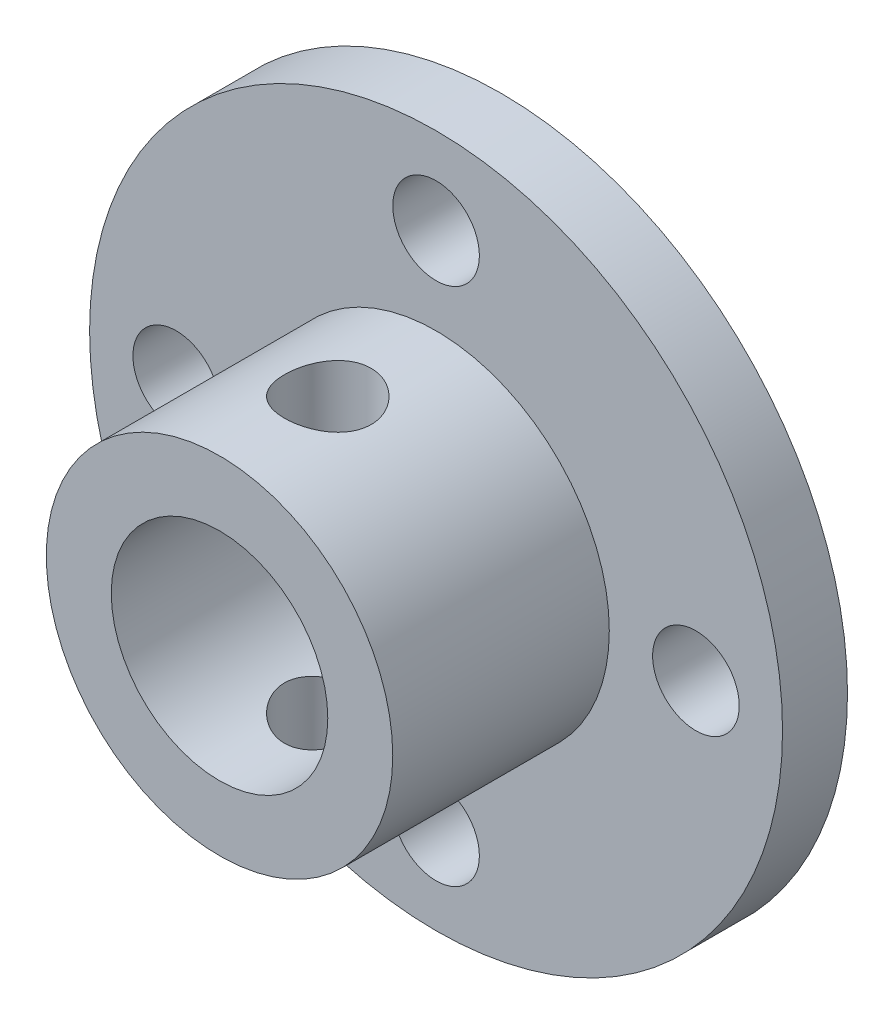
ISO-10303-21;
HEADER;
FILE_DESCRIPTION(('STEP AP214'),'2;1');
FILE_NAME('part.step','',(''),(''),'','','');
FILE_SCHEMA(('AUTOMOTIVE_DESIGN { 1 0 10303 214 1 1 1 1 }'));
ENDSEC;
DATA;
#1=APPLICATION_CONTEXT('core data for automotive mechanical design processes');
#2=APPLICATION_PROTOCOL_DEFINITION('international standard','automotive_design',2000,#1);
#3=PRODUCT_CONTEXT('',#1,'mechanical');
#4=PRODUCT('Part','Part','',(#3));
#5=PRODUCT_RELATED_PRODUCT_CATEGORY('part','',(#4));
#6=PRODUCT_DEFINITION_FORMATION('','',#4);
#7=PRODUCT_DEFINITION_CONTEXT('part definition',#1,'design');
#8=PRODUCT_DEFINITION('design','',#6,#7);
#9=PRODUCT_DEFINITION_SHAPE('','',#8);
#10=(LENGTH_UNIT() NAMED_UNIT(*) SI_UNIT(.MILLI.,.METRE.));
#11=(NAMED_UNIT(*) PLANE_ANGLE_UNIT() SI_UNIT($,.RADIAN.));
#12=(NAMED_UNIT(*) SI_UNIT($,.STERADIAN.) SOLID_ANGLE_UNIT());
#13=UNCERTAINTY_MEASURE_WITH_UNIT(LENGTH_MEASURE(1.E-05),#10,'distance_accuracy_value','');
#14=(GEOMETRIC_REPRESENTATION_CONTEXT(3) GLOBAL_UNCERTAINTY_ASSIGNED_CONTEXT((#13)) GLOBAL_UNIT_ASSIGNED_CONTEXT((#10,
#11,#12)) REPRESENTATION_CONTEXT('',''));
#15=CARTESIAN_POINT('',(0.,0.,0.));
#16=DIRECTION('',(0.,0.,1.));
#17=DIRECTION('',(1.,0.,0.));
#18=AXIS2_PLACEMENT_3D('',#15,#16,#17);
#19=CARTESIAN_POINT('',(0.,0.,3.));
#20=DIRECTION('',(0.,0.,-1.));
#21=DIRECTION('',(-1.,0.,0.));
#22=AXIS2_PLACEMENT_3D('',#19,#20,#21);
#23=CYLINDRICAL_SURFACE('',#22,16.);
#24=CARTESIAN_POINT('',(0.,0.,3.));
#25=DIRECTION('',(0.,0.,1.));
#26=DIRECTION('',(1.,0.,0.));
#27=AXIS2_PLACEMENT_3D('',#24,#25,#26);
#28=CIRCLE('',#27,16.);
#29=CARTESIAN_POINT('',(16.,0.,3.));
#30=VERTEX_POINT('',#29);
#31=EDGE_CURVE('E54',#30,#30,#28,.T.);
#32=ORIENTED_EDGE('',*,*,#31,.F.);
#33=EDGE_LOOP('',(#32));
#34=FACE_BOUND('',#33,.T.);
#35=CARTESIAN_POINT('',(0.,0.,0.));
#36=DIRECTION('',(0.,0.,1.));
#37=DIRECTION('',(1.,0.,0.));
#38=AXIS2_PLACEMENT_3D('',#35,#36,#37);
#39=CIRCLE('',#38,16.);
#40=CARTESIAN_POINT('',(16.,0.,0.));
#41=VERTEX_POINT('',#40);
#42=EDGE_CURVE('E60',#41,#41,#39,.T.);
#43=ORIENTED_EDGE('',*,*,#42,.T.);
#44=EDGE_LOOP('',(#43));
#45=FACE_BOUND('',#44,.T.);
#46=ADVANCED_FACE('F41',(#34,#45),#23,.T.);
#47=CARTESIAN_POINT('',(0.,0.,3.));
#48=DIRECTION('',(0.,0.,1.));
#49=DIRECTION('',(1.,0.,0.));
#50=AXIS2_PLACEMENT_3D('',#47,#48,#49);
#51=PLANE('',#50);
#52=CARTESIAN_POINT('',(0.,12.,3.));
#53=DIRECTION('',(0.,0.,1.));
#54=DIRECTION('',(1.,0.,0.));
#55=AXIS2_PLACEMENT_3D('',#52,#53,#54);
#56=CIRCLE('',#55,2.);
#57=CARTESIAN_POINT('',(2.,12.,3.));
#58=VERTEX_POINT('',#57);
#59=EDGE_CURVE('E280',#58,#58,#56,.T.);
#60=ORIENTED_EDGE('',*,*,#59,.F.);
#61=EDGE_LOOP('',(#60));
#62=FACE_BOUND('',#61,.T.);
#63=CARTESIAN_POINT('',(12.,0.,3.));
#64=DIRECTION('',(0.,0.,1.));
#65=DIRECTION('',(1.,0.,0.));
#66=AXIS2_PLACEMENT_3D('',#63,#64,#65);
#67=CIRCLE('',#66,2.);
#68=CARTESIAN_POINT('',(14.,0.,3.));
#69=VERTEX_POINT('',#68);
#70=EDGE_CURVE('E276',#69,#69,#67,.T.);
#71=ORIENTED_EDGE('',*,*,#70,.F.);
#72=EDGE_LOOP('',(#71));
#73=FACE_BOUND('',#72,.T.);
#74=CARTESIAN_POINT('',(0.,-12.,3.));
#75=DIRECTION('',(0.,0.,1.));
#76=DIRECTION('',(1.,0.,0.));
#77=AXIS2_PLACEMENT_3D('',#74,#75,#76);
#78=CIRCLE('',#77,2.);
#79=CARTESIAN_POINT('',(1.99999999999992,-12.,3.));
#80=VERTEX_POINT('',#79);
#81=EDGE_CURVE('E268',#80,#80,#78,.T.);
#82=ORIENTED_EDGE('',*,*,#81,.F.);
#83=EDGE_LOOP('',(#82));
#84=FACE_BOUND('',#83,.T.);
#85=CARTESIAN_POINT('',(-12.,1.25693328198353E-13,3.));
#86=DIRECTION('',(0.,0.,1.));
#87=DIRECTION('',(1.,0.,0.));
#88=AXIS2_PLACEMENT_3D('',#85,#86,#87);
#89=CIRCLE('',#88,2.);
#90=CARTESIAN_POINT('',(-10.,1.25693328198353E-13,3.));
#91=VERTEX_POINT('',#90);
#92=EDGE_CURVE('E260',#91,#91,#89,.T.);
#93=ORIENTED_EDGE('',*,*,#92,.F.);
#94=EDGE_LOOP('',(#93));
#95=FACE_BOUND('',#94,.T.);
#96=CARTESIAN_POINT('',(0.,0.,3.));
#97=DIRECTION('',(0.,0.,1.));
#98=DIRECTION('',(1.,0.,0.));
#99=AXIS2_PLACEMENT_3D('',#96,#97,#98);
#100=CIRCLE('',#99,8.);
#101=CARTESIAN_POINT('',(8.,0.,3.));
#102=VERTEX_POINT('',#101);
#103=EDGE_CURVE('E10',#102,#102,#100,.T.);
#104=ORIENTED_EDGE('',*,*,#103,.F.);
#105=EDGE_LOOP('',(#104));
#106=FACE_BOUND('',#105,.T.);
#107=ORIENTED_EDGE('',*,*,#31,.T.);
#108=EDGE_LOOP('',(#107));
#109=FACE_BOUND('',#108,.T.);
#110=ADVANCED_FACE('F110',(#62,#73,#84,#95,#106,#109),#51,.T.);
#111=CARTESIAN_POINT('',(0.,0.,0.));
#112=DIRECTION('',(0.,0.,1.));
#113=DIRECTION('',(1.,0.,0.));
#114=AXIS2_PLACEMENT_3D('',#111,#112,#113);
#115=PLANE('',#114);
#116=CARTESIAN_POINT('',(0.,12.,0.));
#117=DIRECTION('',(0.,0.,1.));
#118=DIRECTION('',(1.,0.,0.));
#119=AXIS2_PLACEMENT_3D('',#116,#117,#118);
#120=CIRCLE('',#119,2.);
#121=CARTESIAN_POINT('',(2.,12.,0.));
#122=VERTEX_POINT('',#121);
#123=EDGE_CURVE('E254',#122,#122,#120,.T.);
#124=ORIENTED_EDGE('',*,*,#123,.T.);
#125=EDGE_LOOP('',(#124));
#126=FACE_BOUND('',#125,.T.);
#127=CARTESIAN_POINT('',(12.,0.,0.));
#128=DIRECTION('',(0.,0.,1.));
#129=DIRECTION('',(1.,0.,0.));
#130=AXIS2_PLACEMENT_3D('',#127,#128,#129);
#131=CIRCLE('',#130,2.);
#132=CARTESIAN_POINT('',(14.,0.,0.));
#133=VERTEX_POINT('',#132);
#134=EDGE_CURVE('E272',#133,#133,#131,.T.);
#135=ORIENTED_EDGE('',*,*,#134,.T.);
#136=EDGE_LOOP('',(#135));
#137=FACE_BOUND('',#136,.T.);
#138=CARTESIAN_POINT('',(0.,-12.,0.));
#139=DIRECTION('',(0.,0.,1.));
#140=DIRECTION('',(1.,0.,0.));
#141=AXIS2_PLACEMENT_3D('',#138,#139,#140);
#142=CIRCLE('',#141,2.);
#143=CARTESIAN_POINT('',(1.99999999999992,-12.,0.));
#144=VERTEX_POINT('',#143);
#145=EDGE_CURVE('E264',#144,#144,#142,.T.);
#146=ORIENTED_EDGE('',*,*,#145,.T.);
#147=EDGE_LOOP('',(#146));
#148=FACE_BOUND('',#147,.T.);
#149=CARTESIAN_POINT('',(-12.,1.25693328198353E-13,0.));
#150=DIRECTION('',(0.,0.,1.));
#151=DIRECTION('',(1.,0.,0.));
#152=AXIS2_PLACEMENT_3D('',#149,#150,#151);
#153=CIRCLE('',#152,2.);
#154=CARTESIAN_POINT('',(-10.,1.25693328198353E-13,0.));
#155=VERTEX_POINT('',#154);
#156=EDGE_CURVE('E256',#155,#155,#153,.T.);
#157=ORIENTED_EDGE('',*,*,#156,.T.);
#158=EDGE_LOOP('',(#157));
#159=FACE_BOUND('',#158,.T.);
#160=CARTESIAN_POINT('',(0.,0.,0.));
#161=DIRECTION('',(0.,0.,1.));
#162=DIRECTION('',(1.,0.,0.));
#163=AXIS2_PLACEMENT_3D('',#160,#161,#162);
#164=CIRCLE('',#163,5.);
#165=CARTESIAN_POINT('',(5.,0.,0.));
#166=VERTEX_POINT('',#165);
#167=EDGE_CURVE('E247',#166,#166,#164,.T.);
#168=ORIENTED_EDGE('',*,*,#167,.T.);
#169=EDGE_LOOP('',(#168));
#170=FACE_BOUND('',#169,.T.);
#171=ORIENTED_EDGE('',*,*,#42,.F.);
#172=EDGE_LOOP('',(#171));
#173=FACE_BOUND('',#172,.T.);
#174=ADVANCED_FACE('F108',(#126,#137,#148,#159,#170,#173),#115,.F.);
#175=CARTESIAN_POINT('',(0.,0.,13.));
#176=DIRECTION('',(0.,0.,-1.));
#177=DIRECTION('',(-1.,0.,0.));
#178=AXIS2_PLACEMENT_3D('',#175,#176,#177);
#179=CYLINDRICAL_SURFACE('',#178,8.);
#180=CARTESIAN_POINT('',(0.,-8.,10.));
#181=CARTESIAN_POINT('',(0.110501451559642,-7.9999981315735,9.99999689901579));
#182=CARTESIAN_POINT('',(0.221037543774351,-7.99768770842435,9.99081126563495));
#183=CARTESIAN_POINT('',(0.438941765027377,-7.98869485106526,9.95436646492399));
#184=CARTESIAN_POINT('',(0.546308062494319,-7.98200993893301,9.92709705394953));
#185=CARTESIAN_POINT('',(0.754694496243435,-7.96500835109376,9.85541432871722));
#186=CARTESIAN_POINT('',(0.855722084573335,-7.95469603789411,9.81102160171298));
#187=CARTESIAN_POINT('',(1.04889617587257,-7.93153791743495,9.70642481327355));
#188=CARTESIAN_POINT('',(1.14104237913168,-7.91869202472209,9.64622021850804));
#189=CARTESIAN_POINT('',(1.31573590306789,-7.89156551455591,9.51039894712776));
#190=CARTESIAN_POINT('',(1.39807425341474,-7.87726276197502,9.43451790005459));
#191=CARTESIAN_POINT('',(1.54899856960443,-7.84898160157248,9.27006372678795));
#192=CARTESIAN_POINT('',(1.61758298259892,-7.83500323053157,9.18148916940409));
#193=CARTESIAN_POINT('',(1.74003539039863,-7.80873034264225,8.99253969768401));
#194=CARTESIAN_POINT('',(1.79366962123352,-7.79646392619748,8.89200902558836));
#195=CARTESIAN_POINT('',(1.88319587806766,-7.77532659757355,8.68300211778662));
#196=CARTESIAN_POINT('',(1.91909074058685,-7.76645514259225,8.57452715555731));
#197=CARTESIAN_POINT('',(1.97140644907302,-7.7533396892843,8.35500866906445));
#198=CARTESIAN_POINT('',(1.98820302444274,-7.74900654662681,8.24406013861601));
#199=CARTESIAN_POINT('',(2.00301570008854,-7.74519149946122,8.02084190800087));
#200=CARTESIAN_POINT('',(2.00103485575748,-7.74570880570571,7.90857242574382));
#201=CARTESIAN_POINT('',(1.97864869951961,-7.75145607355756,7.6887789230062));
#202=CARTESIAN_POINT('',(1.95869112025418,-7.75657150676391,7.58120583804623));
#203=CARTESIAN_POINT('',(1.90163224920399,-7.77075612894758,7.37098526545192));
#204=CARTESIAN_POINT('',(1.86452973609252,-7.77982559958985,7.26833812929477));
#205=CARTESIAN_POINT('',(1.77385263724958,-7.80100151874212,7.06968264499716));
#206=CARTESIAN_POINT('',(1.72011555631056,-7.81313769959755,6.97375177094724));
#207=CARTESIAN_POINT('',(1.59780836801993,-7.83906281127988,6.79210838699091));
#208=CARTESIAN_POINT('',(1.52923566507845,-7.85285203112837,6.70639766924367));
#209=CARTESIAN_POINT('',(1.37688456624163,-7.88101174053188,6.54506184574079));
#210=CARTESIAN_POINT('',(1.29272834422115,-7.89538759304001,6.46979401325153));
#211=CARTESIAN_POINT('',(1.11281589000493,-7.92274620771675,6.3343716767148));
#212=CARTESIAN_POINT('',(1.01705930361059,-7.93572892732543,6.27421763431525));
#213=CARTESIAN_POINT('',(0.816154518241856,-7.9589030945892,6.17059921836749));
#214=CARTESIAN_POINT('',(0.710975190944831,-7.96908480170303,6.12719287966076));
#215=CARTESIAN_POINT('',(0.49450134419051,-7.98543889321888,6.05877692572057));
#216=CARTESIAN_POINT('',(0.383207998867313,-7.99161204452374,6.03376379144248));
#217=CARTESIAN_POINT('',(0.160719960520036,-7.999139990285,6.00338991258822));
#218=CARTESIAN_POINT('',(0.0495956266509465,-8.00061404677705,5.9975426318996));
#219=CARTESIAN_POINT('',(-0.172043833068677,-7.99891739752601,6.00433200274065));
#220=CARTESIAN_POINT('',(-0.28255901285946,-7.99574710989128,6.01696699039884));
#221=CARTESIAN_POINT('',(-0.498152358368656,-7.98519441503143,6.05996121118851));
#222=CARTESIAN_POINT('',(-0.603286825291673,-7.97787512247748,6.09005501796932));
#223=CARTESIAN_POINT('',(-0.807009723270016,-7.95984942178845,6.16680944537126));
#224=CARTESIAN_POINT('',(-0.905597492043513,-7.94914267159856,6.21347173908423));
#225=CARTESIAN_POINT('',(-1.0953641792398,-7.92524410568414,6.3229815051663));
#226=CARTESIAN_POINT('',(-1.18638058911444,-7.91201156489243,6.38610148319568));
#227=CARTESIAN_POINT('',(-1.35670215152433,-7.88459345583226,6.52638654506263));
#228=CARTESIAN_POINT('',(-1.43600527863068,-7.87040772335606,6.60355405282254));
#229=CARTESIAN_POINT('',(-1.58265409076364,-7.84225275947695,6.77200261445929));
#230=CARTESIAN_POINT('',(-1.64965849016271,-7.82829738916375,6.86358360400323));
#231=CARTESIAN_POINT('',(-1.7673476786836,-7.80257171169652,7.05697684595429));
#232=CARTESIAN_POINT('',(-1.81803319221058,-7.79080130756035,7.15878864394634));
#233=CARTESIAN_POINT('',(-1.90126856081239,-7.77090792979553,7.36920762988411));
#234=CARTESIAN_POINT('',(-1.93392586220542,-7.76276340389207,7.47777017112535));
#235=CARTESIAN_POINT('',(-1.98046087993837,-7.75102325453578,7.69907951718548));
#236=CARTESIAN_POINT('',(-1.99434270330488,-7.74742663626582,7.81182540137665));
#237=CARTESIAN_POINT('',(-2.00271812044533,-7.74526534938609,8.03482803180694));
#238=CARTESIAN_POINT('',(-1.99775719704016,-7.74655910304351,8.14506324683297));
#239=CARTESIAN_POINT('',(-1.96983637108382,-7.7537054534379,8.36307185155731));
#240=CARTESIAN_POINT('',(-1.94687683024903,-7.75955795855809,8.47084529068487));
#241=CARTESIAN_POINT('',(-1.88390842592373,-7.77508347576963,8.68027794542054));
#242=CARTESIAN_POINT('',(-1.84400187290717,-7.78473353648412,8.78196974032028));
#243=CARTESIAN_POINT('',(-1.74835321814009,-7.80677007633105,8.97728717695159));
#244=CARTESIAN_POINT('',(-1.69260892004558,-7.81915693494364,9.07091169758256));
#245=CARTESIAN_POINT('',(-1.56515699818285,-7.8456751235135,9.25007283866936));
#246=CARTESIAN_POINT('',(-1.49307088388301,-7.85984353109009,9.33533476456528));
#247=CARTESIAN_POINT('',(-1.33571916158631,-7.88810702995048,9.49272939306054));
#248=CARTESIAN_POINT('',(-1.25045042834819,-7.90220210302746,9.56485897348396));
#249=CARTESIAN_POINT('',(-1.06729011560345,-7.92903540863551,9.69521507808614));
#250=CARTESIAN_POINT('',(-0.96919789642185,-7.94174444487824,9.75316615156211));
#251=CARTESIAN_POINT('',(-0.764354746013969,-7.96406566633491,9.85166328392071));
#252=CARTESIAN_POINT('',(-0.65761008458232,-7.97368006933042,9.89222181419805));
#253=CARTESIAN_POINT('',(-0.459213670991295,-7.98730746087389,9.94876244043954));
#254=CARTESIAN_POINT('',(-0.368506894544091,-7.9920344673692,9.96793499073791));
#255=CARTESIAN_POINT('',(-0.185208095381711,-7.99838140309264,9.99355459149592));
#256=CARTESIAN_POINT('',(-0.0926162149901549,-8.00000156601192,10.0000025990737));
#257=CARTESIAN_POINT('',(0.,-8.,10.));
#258=B_SPLINE_CURVE_WITH_KNOTS('',3,(#180,#181,#182,#183,#184,#185,#186,#187,#188,#189,#190,
#191,#192,#193,#194,#195,#196,#197,#198,#199,#200,#201,#202,#203,#204,#205,#206,#207,#208,#209,
#210,#211,#212,#213,#214,#215,#216,#217,#218,#219,#220,#221,#222,#223,#224,#225,#226,#227,#228,
#229,#230,#231,#232,#233,#234,#235,#236,#237,#238,#239,#240,#241,#242,#243,#244,#245,#246,#247,
#248,#249,#250,#251,#252,#253,#254,#255,#256,#257),.UNSPECIFIED.,.T.,.F.,(4,2,2,2,2,2,2,2,2,2,2,
2,2,2,2,2,2,2,2,2,2,2,2,2,2,2,2,2,2,2,2,2,2,2,2,2,2,2,4),(0.,0.33116494996252,0.662517650351866,
0.99347320304814,1.32443992022577,1.66152580582852,1.99864972773416,2.34078196727742,
2.68285948225824,3.01808393468093,3.3532538415469,3.68029996013785,4.00736937959145,
4.337740371696,4.66816921119311,5.00802001296453,5.34788119415424,5.6889097201658,
6.02987298255951,6.36211078603462,6.69431868154751,7.02160366023144,7.34892169767481,
7.68204783424897,8.01523150681786,8.35659345610396,8.69794025003772,9.03723006156476,
9.37644564340972,9.70591707202578,10.0353818794581,10.3628853408369,10.6904342418696,
11.0265276855097,11.3627009303165,11.7049624733721,12.0469781843289,12.3245632392729,
12.6021274139515),.UNSPECIFIED.);
#259=CARTESIAN_POINT('',(0.,-8.,10.));
#260=VERTEX_POINT('',#259);
#261=EDGE_CURVE('E98',#260,#260,#258,.T.);
#262=ORIENTED_EDGE('',*,*,#261,.T.);
#263=EDGE_LOOP('',(#262));
#264=FACE_BOUND('',#263,.T.);
#265=CARTESIAN_POINT('',(0.,8.,10.));
#266=CARTESIAN_POINT('',(-0.110501451559642,7.9999981315735,9.99999689901579));
#267=CARTESIAN_POINT('',(-0.221037543774351,7.99768770842435,9.99081126563495));
#268=CARTESIAN_POINT('',(-0.438941765027377,7.98869485106526,9.95436646492399));
#269=CARTESIAN_POINT('',(-0.546308062494319,7.98200993893301,9.92709705394953));
#270=CARTESIAN_POINT('',(-0.754694496243435,7.96500835109376,9.85541432871722));
#271=CARTESIAN_POINT('',(-0.855722084573335,7.95469603789411,9.81102160171298));
#272=CARTESIAN_POINT('',(-1.04889617587257,7.93153791743495,9.70642481327355));
#273=CARTESIAN_POINT('',(-1.14104237913168,7.91869202472209,9.64622021850804));
#274=CARTESIAN_POINT('',(-1.31573590306789,7.89156551455591,9.51039894712776));
#275=CARTESIAN_POINT('',(-1.39807425341474,7.87726276197502,9.43451790005459));
#276=CARTESIAN_POINT('',(-1.54899856960443,7.84898160157248,9.27006372678795));
#277=CARTESIAN_POINT('',(-1.61758298259892,7.83500323053157,9.18148916940409));
#278=CARTESIAN_POINT('',(-1.74003539039863,7.80873034264225,8.99253969768401));
#279=CARTESIAN_POINT('',(-1.79366962123352,7.79646392619748,8.89200902558836));
#280=CARTESIAN_POINT('',(-1.88319587806766,7.77532659757355,8.68300211778662));
#281=CARTESIAN_POINT('',(-1.91909074058685,7.76645514259225,8.57452715555731));
#282=CARTESIAN_POINT('',(-1.97140644907302,7.7533396892843,8.35500866906445));
#283=CARTESIAN_POINT('',(-1.98820302444274,7.74900654662681,8.24406013861601));
#284=CARTESIAN_POINT('',(-2.00301570008854,7.74519149946122,8.02084190800087));
#285=CARTESIAN_POINT('',(-2.00103485575748,7.74570880570571,7.90857242574382));
#286=CARTESIAN_POINT('',(-1.97864869951961,7.75145607355756,7.6887789230062));
#287=CARTESIAN_POINT('',(-1.95869112025418,7.75657150676391,7.58120583804623));
#288=CARTESIAN_POINT('',(-1.90163224920399,7.77075612894758,7.37098526545192));
#289=CARTESIAN_POINT('',(-1.86452973609252,7.77982559958985,7.26833812929477));
#290=CARTESIAN_POINT('',(-1.77385263724958,7.80100151874212,7.06968264499716));
#291=CARTESIAN_POINT('',(-1.72011555631056,7.81313769959755,6.97375177094724));
#292=CARTESIAN_POINT('',(-1.59780836801993,7.83906281127988,6.79210838699091));
#293=CARTESIAN_POINT('',(-1.52923566507845,7.85285203112837,6.70639766924367));
#294=CARTESIAN_POINT('',(-1.37688456624163,7.88101174053188,6.54506184574079));
#295=CARTESIAN_POINT('',(-1.29272834422115,7.89538759304001,6.46979401325153));
#296=CARTESIAN_POINT('',(-1.11281589000493,7.92274620771675,6.3343716767148));
#297=CARTESIAN_POINT('',(-1.01705930361059,7.93572892732543,6.27421763431525));
#298=CARTESIAN_POINT('',(-0.816154518241856,7.9589030945892,6.17059921836749));
#299=CARTESIAN_POINT('',(-0.710975190944831,7.96908480170303,6.12719287966076));
#300=CARTESIAN_POINT('',(-0.49450134419051,7.98543889321888,6.05877692572057));
#301=CARTESIAN_POINT('',(-0.383207998867313,7.99161204452374,6.03376379144248));
#302=CARTESIAN_POINT('',(-0.160719960520036,7.999139990285,6.00338991258822));
#303=CARTESIAN_POINT('',(-0.0495956266509465,8.00061404677705,5.9975426318996));
#304=CARTESIAN_POINT('',(0.172043833068677,7.99891739752601,6.00433200274065));
#305=CARTESIAN_POINT('',(0.28255901285946,7.99574710989128,6.01696699039884));
#306=CARTESIAN_POINT('',(0.498152358368656,7.98519441503143,6.05996121118851));
#307=CARTESIAN_POINT('',(0.603286825291673,7.97787512247748,6.09005501796932));
#308=CARTESIAN_POINT('',(0.807009723270016,7.95984942178845,6.16680944537126));
#309=CARTESIAN_POINT('',(0.905597492043513,7.94914267159856,6.21347173908423));
#310=CARTESIAN_POINT('',(1.0953641792398,7.92524410568414,6.3229815051663));
#311=CARTESIAN_POINT('',(1.18638058911444,7.91201156489243,6.38610148319568));
#312=CARTESIAN_POINT('',(1.35670215152433,7.88459345583226,6.52638654506263));
#313=CARTESIAN_POINT('',(1.43600527863068,7.87040772335606,6.60355405282254));
#314=CARTESIAN_POINT('',(1.58265409076364,7.84225275947695,6.77200261445929));
#315=CARTESIAN_POINT('',(1.64965849016271,7.82829738916375,6.86358360400323));
#316=CARTESIAN_POINT('',(1.7673476786836,7.80257171169652,7.05697684595429));
#317=CARTESIAN_POINT('',(1.81803319221058,7.79080130756035,7.15878864394634));
#318=CARTESIAN_POINT('',(1.90126856081239,7.77090792979553,7.36920762988411));
#319=CARTESIAN_POINT('',(1.93392586220542,7.76276340389207,7.47777017112535));
#320=CARTESIAN_POINT('',(1.98046087993837,7.75102325453578,7.69907951718548));
#321=CARTESIAN_POINT('',(1.99434270330488,7.74742663626582,7.81182540137665));
#322=CARTESIAN_POINT('',(2.00271812044533,7.74526534938609,8.03482803180694));
#323=CARTESIAN_POINT('',(1.99775719704016,7.74655910304351,8.14506324683297));
#324=CARTESIAN_POINT('',(1.96983637108382,7.7537054534379,8.36307185155731));
#325=CARTESIAN_POINT('',(1.94687683024903,7.75955795855809,8.47084529068487));
#326=CARTESIAN_POINT('',(1.88390842592373,7.77508347576963,8.68027794542054));
#327=CARTESIAN_POINT('',(1.84400187290717,7.78473353648412,8.78196974032028));
#328=CARTESIAN_POINT('',(1.74835321814009,7.80677007633105,8.97728717695159));
#329=CARTESIAN_POINT('',(1.69260892004558,7.81915693494364,9.07091169758256));
#330=CARTESIAN_POINT('',(1.56515699818285,7.8456751235135,9.25007283866936));
#331=CARTESIAN_POINT('',(1.49307088388301,7.85984353109009,9.33533476456528));
#332=CARTESIAN_POINT('',(1.33571916158631,7.88810702995048,9.49272939306054));
#333=CARTESIAN_POINT('',(1.25045042834819,7.90220210302746,9.56485897348396));
#334=CARTESIAN_POINT('',(1.06729011560345,7.92903540863551,9.69521507808614));
#335=CARTESIAN_POINT('',(0.96919789642185,7.94174444487824,9.75316615156211));
#336=CARTESIAN_POINT('',(0.764354746013969,7.96406566633491,9.85166328392071));
#337=CARTESIAN_POINT('',(0.65761008458232,7.97368006933042,9.89222181419805));
#338=CARTESIAN_POINT('',(0.459213670991295,7.98730746087389,9.94876244043954));
#339=CARTESIAN_POINT('',(0.368506894544091,7.9920344673692,9.96793499073791));
#340=CARTESIAN_POINT('',(0.185208095381711,7.99838140309264,9.99355459149592));
#341=CARTESIAN_POINT('',(0.0926162149901549,8.00000156601192,10.0000025990737));
#342=CARTESIAN_POINT('',(0.,8.,10.));
#343=B_SPLINE_CURVE_WITH_KNOTS('',3,(#265,#266,#267,#268,#269,#270,#271,#272,#273,#274,#275,
#276,#277,#278,#279,#280,#281,#282,#283,#284,#285,#286,#287,#288,#289,#290,#291,#292,#293,#294,
#295,#296,#297,#298,#299,#300,#301,#302,#303,#304,#305,#306,#307,#308,#309,#310,#311,#312,#313,
#314,#315,#316,#317,#318,#319,#320,#321,#322,#323,#324,#325,#326,#327,#328,#329,#330,#331,#332,
#333,#334,#335,#336,#337,#338,#339,#340,#341,#342),.UNSPECIFIED.,.T.,.F.,(4,2,2,2,2,2,2,2,2,2,2,
2,2,2,2,2,2,2,2,2,2,2,2,2,2,2,2,2,2,2,2,2,2,2,2,2,2,2,4),(0.,0.33116494996252,0.662517650351866,
0.99347320304814,1.32443992022577,1.66152580582852,1.99864972773416,2.34078196727742,
2.68285948225824,3.01808393468093,3.3532538415469,3.68029996013785,4.00736937959145,
4.337740371696,4.66816921119311,5.00802001296453,5.34788119415424,5.6889097201658,
6.02987298255951,6.36211078603462,6.69431868154751,7.02160366023144,7.34892169767481,
7.68204783424897,8.01523150681786,8.35659345610396,8.69794025003772,9.03723006156476,
9.37644564340972,9.70591707202578,10.0353818794581,10.3628853408369,10.6904342418696,
11.0265276855097,11.3627009303165,11.7049624733721,12.0469781843289,12.3245632392729,
12.6021274139515),.UNSPECIFIED.);
#344=CARTESIAN_POINT('',(0.,8.,10.));
#345=VERTEX_POINT('',#344);
#346=EDGE_CURVE('E91',#345,#345,#343,.T.);
#347=ORIENTED_EDGE('',*,*,#346,.T.);
#348=EDGE_LOOP('',(#347));
#349=FACE_BOUND('',#348,.T.);
#350=CARTESIAN_POINT('',(0.,0.,13.));
#351=DIRECTION('',(0.,0.,1.));
#352=DIRECTION('',(1.,0.,0.));
#353=AXIS2_PLACEMENT_3D('',#350,#351,#352);
#354=CIRCLE('',#353,8.);
#355=CARTESIAN_POINT('',(8.,0.,13.));
#356=VERTEX_POINT('',#355);
#357=EDGE_CURVE('E63',#356,#356,#354,.T.);
#358=ORIENTED_EDGE('',*,*,#357,.F.);
#359=EDGE_LOOP('',(#358));
#360=FACE_BOUND('',#359,.T.);
#361=ORIENTED_EDGE('',*,*,#103,.T.);
#362=EDGE_LOOP('',(#361));
#363=FACE_BOUND('',#362,.T.);
#364=ADVANCED_FACE('F103',(#264,#349,#360,#363),#179,.T.);
#365=CARTESIAN_POINT('',(0.,0.,13.));
#366=DIRECTION('',(0.,0.,1.));
#367=DIRECTION('',(1.,0.,0.));
#368=AXIS2_PLACEMENT_3D('',#365,#366,#367);
#369=PLANE('',#368);
#370=CARTESIAN_POINT('',(0.,0.,13.));
#371=DIRECTION('',(0.,0.,1.));
#372=DIRECTION('',(1.,0.,0.));
#373=AXIS2_PLACEMENT_3D('',#370,#371,#372);
#374=CIRCLE('',#373,5.);
#375=CARTESIAN_POINT('',(5.,0.,13.));
#376=VERTEX_POINT('',#375);
#377=EDGE_CURVE('E242',#376,#376,#374,.T.);
#378=ORIENTED_EDGE('',*,*,#377,.F.);
#379=EDGE_LOOP('',(#378));
#380=FACE_BOUND('',#379,.T.);
#381=ORIENTED_EDGE('',*,*,#357,.T.);
#382=EDGE_LOOP('',(#381));
#383=FACE_BOUND('',#382,.T.);
#384=ADVANCED_FACE('F107',(#380,#383),#369,.T.);
#385=CARTESIAN_POINT('',(0.,0.,0.));
#386=DIRECTION('',(0.,0.,1.));
#387=DIRECTION('',(1.,0.,0.));
#388=AXIS2_PLACEMENT_3D('',#385,#386,#387);
#389=CYLINDRICAL_SURFACE('',#388,5.);
#390=CARTESIAN_POINT('',(0.,-5.,10.));
#391=CARTESIAN_POINT('',(-0.107493005442891,-4.99999271227085,9.99999014817627));
#392=CARTESIAN_POINT('',(-0.215172564090673,-4.99649294306932,9.99128224791162));
#393=CARTESIAN_POINT('',(-0.427496480417896,-4.98283453100641,9.95675229647876));
#394=CARTESIAN_POINT('',(-0.532131777561248,-4.97265778698877,9.93088372091387));
#395=CARTESIAN_POINT('',(-0.734953922727403,-4.94674209213118,9.86312392194117));
#396=CARTESIAN_POINT('',(-0.833160661616958,-4.93102136364072,9.82128515378327));
#397=CARTESIAN_POINT('',(-1.02107197032837,-4.89556610796078,9.72298082667345));
#398=CARTESIAN_POINT('',(-1.11077947675099,-4.87583297458057,9.66652034508107));
#399=CARTESIAN_POINT('',(-1.28350100757039,-4.83330886170419,9.53776450143906));
#400=CARTESIAN_POINT('',(-1.36606227255021,-4.81042296929191,9.46489334375974));
#401=CARTESIAN_POINT('',(-1.51817500478472,-4.76460576906195,9.30659999652322));
#402=CARTESIAN_POINT('',(-1.58772010713353,-4.74167444453792,9.22117170278826));
#403=CARTESIAN_POINT('',(-1.71487456729288,-4.69722791797136,9.03557192975773));
#404=CARTESIAN_POINT('',(-1.77181498119547,-4.67582115964951,8.9349135139768));
#405=CARTESIAN_POINT('',(-1.86775471903715,-4.63833647186792,8.72446360157996));
#406=CARTESIAN_POINT('',(-1.90676256428583,-4.62225601244176,8.61467647215164));
#407=CARTESIAN_POINT('',(-1.96389882339587,-4.59826357660818,8.3942876664079));
#408=CARTESIAN_POINT('',(-1.98289396580565,-4.59001420355605,8.28394876442379));
#409=CARTESIAN_POINT('',(-2.00217296164003,-4.58164004049144,8.06136500169273));
#410=CARTESIAN_POINT('',(-2.00246601631322,-4.58151125522768,7.94912110537499));
#411=CARTESIAN_POINT('',(-1.98498936750454,-4.58910500279994,7.73424332854196));
#412=CARTESIAN_POINT('',(-1.96847531430514,-4.5962817503845,7.63148428559097));
#413=CARTESIAN_POINT('',(-1.91994688029782,-4.61676187607836,7.43034044399329));
#414=CARTESIAN_POINT('',(-1.88792979480463,-4.63006632321673,7.33195641188969));
#415=CARTESIAN_POINT('',(-1.80869473255107,-4.6615948508853,7.13998216380396));
#416=CARTESIAN_POINT('',(-1.76117986231532,-4.67991379280788,7.04653076094531));
#417=CARTESIAN_POINT('',(-1.65250646073221,-4.7193811638989,6.86858418363844));
#418=CARTESIAN_POINT('',(-1.59134280510084,-4.74053065456848,6.78409239059719));
#419=CARTESIAN_POINT('',(-1.45155059945443,-4.78526736742271,6.619590271198));
#420=CARTESIAN_POINT('',(-1.37193746297063,-4.80891664976152,6.54043127055398));
#421=CARTESIAN_POINT('',(-1.20031442743019,-4.85459824958282,6.39631552199796));
#422=CARTESIAN_POINT('',(-1.10830206533443,-4.87663024445325,6.33136160258971));
#423=CARTESIAN_POINT('',(-0.912077652605843,-4.91714681264548,6.21638255258417));
#424=CARTESIAN_POINT('',(-0.807660491346477,-4.93555270095415,6.16667771880295));
#425=CARTESIAN_POINT('',(-0.591023765482882,-4.96614828328759,6.08583213892194));
#426=CARTESIAN_POINT('',(-0.478808196849674,-4.97834113462382,6.05468196244259));
#427=CARTESIAN_POINT('',(-0.25689588760782,-4.99456139506911,6.0135517045803));
#428=CARTESIAN_POINT('',(-0.147443293985534,-4.99902945833514,6.00242754574644));
#429=CARTESIAN_POINT('',(0.0718453098078172,-5.00068478510631,5.99828689947139));
#430=CARTESIAN_POINT('',(0.181681213223924,-4.99787393582291,6.00526571845249));
#431=CARTESIAN_POINT('',(0.393432739121987,-4.98557567063753,6.03629175255199));
#432=CARTESIAN_POINT('',(0.495482491775474,-4.97639391345523,6.05955798035098));
#433=CARTESIAN_POINT('',(0.69413542806078,-4.952594414055,6.12143570830981));
#434=CARTESIAN_POINT('',(0.790737910224844,-4.9379759735653,6.16004917966868));
#435=CARTESIAN_POINT('',(0.979078785816702,-4.90416594770812,6.25278493967995));
#436=CARTESIAN_POINT('',(1.07057802275541,-4.88484815979804,6.30734547204315));
#437=CARTESIAN_POINT('',(1.24344359124656,-4.84373364745525,6.42994032390564));
#438=CARTESIAN_POINT('',(1.32480584076113,-4.8219359311027,6.49798004292261));
#439=CARTESIAN_POINT('',(1.48072304302882,-4.77645117638112,6.65087001294963));
#440=CARTESIAN_POINT('',(1.55447393380606,-4.75273441425052,6.73653354150621));
#441=CARTESIAN_POINT('',(1.68675119741371,-4.70741672917132,6.91944008300937));
#442=CARTESIAN_POINT('',(1.74527506133751,-4.68581615526511,7.01668500033995));
#443=CARTESIAN_POINT('',(1.84580750193163,-4.64714299907709,7.22146169459411));
#444=CARTESIAN_POINT('',(1.88765059453445,-4.63011630884788,7.32908399921231));
#445=CARTESIAN_POINT('',(1.9522962197053,-4.60323673477932,7.55073365171516));
#446=CARTESIAN_POINT('',(1.97511280526932,-4.59337855695998,7.66475620581243));
#447=CARTESIAN_POINT('',(1.9997156172784,-4.58271759299926,7.88712790177454));
#448=CARTESIAN_POINT('',(2.00289708230287,-4.58131421008171,7.99529483959335));
#449=CARTESIAN_POINT('',(1.99180315927752,-4.58614836033098,8.21054485771329));
#450=CARTESIAN_POINT('',(1.97752998791378,-4.59238492324793,8.31762807390258));
#451=CARTESIAN_POINT('',(1.93307136615365,-4.61126649079021,8.52333218985504));
#452=CARTESIAN_POINT('',(1.90353749357098,-4.62364831827449,8.622120274433));
#453=CARTESIAN_POINT('',(1.83000544849101,-4.65324001232697,8.81337862961348));
#454=CARTESIAN_POINT('',(1.78600328139381,-4.67045121206007,8.90584714689983));
#455=CARTESIAN_POINT('',(1.68187276275973,-4.70898609604491,9.08760961927078));
#456=CARTESIAN_POINT('',(1.62096533515949,-4.73048882313242,9.17641867013048));
#457=CARTESIAN_POINT('',(1.4858921192715,-4.77463804372237,9.34299331720375));
#458=CARTESIAN_POINT('',(1.41172233481812,-4.79728488048406,9.42075557212831));
#459=CARTESIAN_POINT('',(1.24650550627246,-4.84293567087394,9.56820285326362));
#460=CARTESIAN_POINT('',(1.15467600114614,-4.86586757962185,9.63703730689807));
#461=CARTESIAN_POINT('',(0.959900320285779,-4.90800406713717,9.75833704262164));
#462=CARTESIAN_POINT('',(0.856949004547237,-4.92720691092906,9.81079471215253));
#463=CARTESIAN_POINT('',(0.644738062495202,-4.95939714815861,9.89662221519029));
#464=CARTESIAN_POINT('',(0.535631618219695,-4.97249363055028,9.93032932356034));
#465=CARTESIAN_POINT('',(0.312876546281219,-4.99144306209366,9.97863912095427));
#466=CARTESIAN_POINT('',(0.199243525858912,-4.99731899495638,9.9933024367439));
#467=CARTESIAN_POINT('',(0.0569122978909291,-4.99975899504136,9.99939538097827));
#468=CARTESIAN_POINT('',(0.0284626887407581,-5.00000192969176,10.0000026086292));
#469=CARTESIAN_POINT('',(0.,-5.,10.));
#470=B_SPLINE_CURVE_WITH_KNOTS('',3,(#390,#391,#392,#393,#394,#395,#396,#397,#398,#399,#400,
#401,#402,#403,#404,#405,#406,#407,#408,#409,#410,#411,#412,#413,#414,#415,#416,#417,#418,#419,
#420,#421,#422,#423,#424,#425,#426,#427,#428,#429,#430,#431,#432,#433,#434,#435,#436,#437,#438,
#439,#440,#441,#442,#443,#444,#445,#446,#447,#448,#449,#450,#451,#452,#453,#454,#455,#456,#457,
#458,#459,#460,#461,#462,#463,#464,#465,#466,#467,#468,#469),.UNSPECIFIED.,.T.,.F.,(4,2,2,2,2,2,
2,2,2,2,2,2,2,2,2,2,2,2,2,2,2,2,2,2,2,2,2,2,2,2,2,2,2,2,2,2,2,2,2,4),(0.,0.322402987893071,
0.645683636007934,0.96791145747158,1.29002753567984,1.62597381700397,1.96208394934411,
2.31315258819217,2.66405423118268,2.99904105308829,3.33386306340488,3.64538328401372,
3.95695787256047,4.27489126298816,4.59294421938183,4.93558349186557,5.27829092839733,
5.62776913162806,5.9770695611379,6.30569184528007,6.63422893570082,6.94800455564365,
7.26182048993796,7.58523513398262,7.90877959498969,8.25368474624413,8.59864669043748,
8.94695045140828,9.29499672645934,9.61799673392748,9.94095572563045,10.2511431854877,
10.5614163580516,10.8894546805669,11.2175920134839,11.5670042353384,11.9165786364053,
12.2596430101332,12.6016125240434,12.686980458968),.UNSPECIFIED.);
#471=CARTESIAN_POINT('',(0.,-5.,10.));
#472=VERTEX_POINT('',#471);
#473=EDGE_CURVE('E44',#472,#472,#470,.T.);
#474=ORIENTED_EDGE('',*,*,#473,.T.);
#475=EDGE_LOOP('',(#474));
#476=FACE_BOUND('',#475,.T.);
#477=CARTESIAN_POINT('',(0.,5.,10.));
#478=CARTESIAN_POINT('',(0.107493005442891,4.99999271227085,9.99999014817627));
#479=CARTESIAN_POINT('',(0.215172564090673,4.99649294306932,9.99128224791162));
#480=CARTESIAN_POINT('',(0.427496480417896,4.98283453100641,9.95675229647876));
#481=CARTESIAN_POINT('',(0.532131777561248,4.97265778698877,9.93088372091387));
#482=CARTESIAN_POINT('',(0.734953922727403,4.94674209213118,9.86312392194117));
#483=CARTESIAN_POINT('',(0.833160661616958,4.93102136364072,9.82128515378327));
#484=CARTESIAN_POINT('',(1.02107197032837,4.89556610796078,9.72298082667345));
#485=CARTESIAN_POINT('',(1.11077947675099,4.87583297458057,9.66652034508107));
#486=CARTESIAN_POINT('',(1.28350100757039,4.83330886170419,9.53776450143906));
#487=CARTESIAN_POINT('',(1.36606227255021,4.81042296929191,9.46489334375974));
#488=CARTESIAN_POINT('',(1.51817500478472,4.76460576906195,9.30659999652322));
#489=CARTESIAN_POINT('',(1.58772010713353,4.74167444453792,9.22117170278826));
#490=CARTESIAN_POINT('',(1.71487456729288,4.69722791797136,9.03557192975773));
#491=CARTESIAN_POINT('',(1.77181498119547,4.67582115964951,8.9349135139768));
#492=CARTESIAN_POINT('',(1.86775471903715,4.63833647186792,8.72446360157996));
#493=CARTESIAN_POINT('',(1.90676256428583,4.62225601244176,8.61467647215164));
#494=CARTESIAN_POINT('',(1.96389882339587,4.59826357660818,8.3942876664079));
#495=CARTESIAN_POINT('',(1.98289396580565,4.59001420355605,8.28394876442379));
#496=CARTESIAN_POINT('',(2.00217296164003,4.58164004049144,8.06136500169273));
#497=CARTESIAN_POINT('',(2.00246601631322,4.58151125522768,7.94912110537499));
#498=CARTESIAN_POINT('',(1.98498936750454,4.58910500279994,7.73424332854196));
#499=CARTESIAN_POINT('',(1.96847531430514,4.5962817503845,7.63148428559097));
#500=CARTESIAN_POINT('',(1.91994688029782,4.61676187607836,7.43034044399329));
#501=CARTESIAN_POINT('',(1.88792979480463,4.63006632321673,7.33195641188969));
#502=CARTESIAN_POINT('',(1.80869473255107,4.6615948508853,7.13998216380396));
#503=CARTESIAN_POINT('',(1.76117986231532,4.67991379280788,7.04653076094531));
#504=CARTESIAN_POINT('',(1.65250646073221,4.7193811638989,6.86858418363844));
#505=CARTESIAN_POINT('',(1.59134280510084,4.74053065456848,6.78409239059719));
#506=CARTESIAN_POINT('',(1.45155059945443,4.78526736742271,6.619590271198));
#507=CARTESIAN_POINT('',(1.37193746297063,4.80891664976152,6.54043127055398));
#508=CARTESIAN_POINT('',(1.20031442743019,4.85459824958282,6.39631552199796));
#509=CARTESIAN_POINT('',(1.10830206533443,4.87663024445325,6.33136160258971));
#510=CARTESIAN_POINT('',(0.912077652605843,4.91714681264548,6.21638255258417));
#511=CARTESIAN_POINT('',(0.807660491346477,4.93555270095415,6.16667771880295));
#512=CARTESIAN_POINT('',(0.591023765482882,4.96614828328759,6.08583213892194));
#513=CARTESIAN_POINT('',(0.478808196849674,4.97834113462382,6.05468196244259));
#514=CARTESIAN_POINT('',(0.25689588760782,4.99456139506911,6.0135517045803));
#515=CARTESIAN_POINT('',(0.147443293985534,4.99902945833514,6.00242754574644));
#516=CARTESIAN_POINT('',(-0.0718453098078172,5.00068478510631,5.99828689947139));
#517=CARTESIAN_POINT('',(-0.181681213223924,4.99787393582291,6.00526571845249));
#518=CARTESIAN_POINT('',(-0.393432739121987,4.98557567063753,6.03629175255199));
#519=CARTESIAN_POINT('',(-0.495482491775474,4.97639391345523,6.05955798035098));
#520=CARTESIAN_POINT('',(-0.69413542806078,4.952594414055,6.12143570830981));
#521=CARTESIAN_POINT('',(-0.790737910224844,4.9379759735653,6.16004917966868));
#522=CARTESIAN_POINT('',(-0.979078785816702,4.90416594770812,6.25278493967995));
#523=CARTESIAN_POINT('',(-1.07057802275541,4.88484815979804,6.30734547204315));
#524=CARTESIAN_POINT('',(-1.24344359124656,4.84373364745525,6.42994032390564));
#525=CARTESIAN_POINT('',(-1.32480584076113,4.8219359311027,6.49798004292261));
#526=CARTESIAN_POINT('',(-1.48072304302882,4.77645117638112,6.65087001294963));
#527=CARTESIAN_POINT('',(-1.55447393380606,4.75273441425052,6.73653354150621));
#528=CARTESIAN_POINT('',(-1.68675119741371,4.70741672917132,6.91944008300937));
#529=CARTESIAN_POINT('',(-1.74527506133751,4.68581615526511,7.01668500033995));
#530=CARTESIAN_POINT('',(-1.84580750193163,4.64714299907709,7.22146169459411));
#531=CARTESIAN_POINT('',(-1.88765059453445,4.63011630884788,7.32908399921231));
#532=CARTESIAN_POINT('',(-1.9522962197053,4.60323673477932,7.55073365171516));
#533=CARTESIAN_POINT('',(-1.97511280526932,4.59337855695998,7.66475620581243));
#534=CARTESIAN_POINT('',(-1.9997156172784,4.58271759299926,7.88712790177454));
#535=CARTESIAN_POINT('',(-2.00289708230287,4.58131421008171,7.99529483959335));
#536=CARTESIAN_POINT('',(-1.99180315927752,4.58614836033098,8.21054485771329));
#537=CARTESIAN_POINT('',(-1.97752998791378,4.59238492324793,8.31762807390258));
#538=CARTESIAN_POINT('',(-1.93307136615365,4.61126649079021,8.52333218985504));
#539=CARTESIAN_POINT('',(-1.90353749357098,4.62364831827449,8.622120274433));
#540=CARTESIAN_POINT('',(-1.83000544849101,4.65324001232697,8.81337862961348));
#541=CARTESIAN_POINT('',(-1.78600328139381,4.67045121206007,8.90584714689983));
#542=CARTESIAN_POINT('',(-1.68187276275973,4.70898609604491,9.08760961927078));
#543=CARTESIAN_POINT('',(-1.62096533515949,4.73048882313242,9.17641867013048));
#544=CARTESIAN_POINT('',(-1.4858921192715,4.77463804372237,9.34299331720375));
#545=CARTESIAN_POINT('',(-1.41172233481812,4.79728488048406,9.42075557212831));
#546=CARTESIAN_POINT('',(-1.24650550627246,4.84293567087394,9.56820285326362));
#547=CARTESIAN_POINT('',(-1.15467600114614,4.86586757962185,9.63703730689807));
#548=CARTESIAN_POINT('',(-0.959900320285779,4.90800406713717,9.75833704262164));
#549=CARTESIAN_POINT('',(-0.856949004547237,4.92720691092906,9.81079471215253));
#550=CARTESIAN_POINT('',(-0.644738062495202,4.95939714815861,9.89662221519029));
#551=CARTESIAN_POINT('',(-0.535631618219695,4.97249363055028,9.93032932356034));
#552=CARTESIAN_POINT('',(-0.312876546281219,4.99144306209366,9.97863912095427));
#553=CARTESIAN_POINT('',(-0.199243525858912,4.99731899495638,9.9933024367439));
#554=CARTESIAN_POINT('',(-0.0569122978909291,4.99975899504136,9.99939538097827));
#555=CARTESIAN_POINT('',(-0.0284626887407581,5.00000192969176,10.0000026086292));
#556=CARTESIAN_POINT('',(0.,5.,10.));
#557=B_SPLINE_CURVE_WITH_KNOTS('',3,(#477,#478,#479,#480,#481,#482,#483,#484,#485,#486,#487,
#488,#489,#490,#491,#492,#493,#494,#495,#496,#497,#498,#499,#500,#501,#502,#503,#504,#505,#506,
#507,#508,#509,#510,#511,#512,#513,#514,#515,#516,#517,#518,#519,#520,#521,#522,#523,#524,#525,
#526,#527,#528,#529,#530,#531,#532,#533,#534,#535,#536,#537,#538,#539,#540,#541,#542,#543,#544,
#545,#546,#547,#548,#549,#550,#551,#552,#553,#554,#555,#556),.UNSPECIFIED.,.T.,.F.,(4,2,2,2,2,2,
2,2,2,2,2,2,2,2,2,2,2,2,2,2,2,2,2,2,2,2,2,2,2,2,2,2,2,2,2,2,2,2,2,4),(0.,0.322402987893071,
0.645683636007934,0.96791145747158,1.29002753567984,1.62597381700397,1.96208394934411,
2.31315258819217,2.66405423118268,2.99904105308829,3.33386306340488,3.64538328401372,
3.95695787256047,4.27489126298816,4.59294421938183,4.93558349186557,5.27829092839733,
5.62776913162806,5.9770695611379,6.30569184528007,6.63422893570082,6.94800455564365,
7.26182048993796,7.58523513398262,7.90877959498969,8.25368474624413,8.59864669043748,
8.94695045140828,9.29499672645934,9.61799673392748,9.94095572563045,10.2511431854877,
10.5614163580516,10.8894546805669,11.2175920134839,11.5670042353384,11.9165786364053,
12.2596430101332,12.6016125240434,12.686980458968),.UNSPECIFIED.);
#558=CARTESIAN_POINT('',(0.,5.,10.));
#559=VERTEX_POINT('',#558);
#560=EDGE_CURVE('E68',#559,#559,#557,.T.);
#561=ORIENTED_EDGE('',*,*,#560,.T.);
#562=EDGE_LOOP('',(#561));
#563=FACE_BOUND('',#562,.T.);
#564=ORIENTED_EDGE('',*,*,#167,.F.);
#565=EDGE_LOOP('',(#564));
#566=FACE_BOUND('',#565,.T.);
#567=ORIENTED_EDGE('',*,*,#377,.T.);
#568=EDGE_LOOP('',(#567));
#569=FACE_BOUND('',#568,.T.);
#570=ADVANCED_FACE('F74',(#476,#563,#566,#569),#389,.F.);
#571=CARTESIAN_POINT('',(-12.,1.25693328198353E-13,0.));
#572=DIRECTION('',(0.,0.,1.));
#573=DIRECTION('',(1.,0.,0.));
#574=AXIS2_PLACEMENT_3D('',#571,#572,#573);
#575=CYLINDRICAL_SURFACE('',#574,2.);
#576=ORIENTED_EDGE('',*,*,#156,.F.);
#577=EDGE_LOOP('',(#576));
#578=FACE_BOUND('',#577,.T.);
#579=ORIENTED_EDGE('',*,*,#92,.T.);
#580=EDGE_LOOP('',(#579));
#581=FACE_BOUND('',#580,.T.);
#582=ADVANCED_FACE('F149',(#578,#581),#575,.F.);
#583=CARTESIAN_POINT('',(0.,-12.,0.));
#584=DIRECTION('',(0.,0.,1.));
#585=DIRECTION('',(1.,0.,0.));
#586=AXIS2_PLACEMENT_3D('',#583,#584,#585);
#587=CYLINDRICAL_SURFACE('',#586,2.);
#588=ORIENTED_EDGE('',*,*,#145,.F.);
#589=EDGE_LOOP('',(#588));
#590=FACE_BOUND('',#589,.T.);
#591=ORIENTED_EDGE('',*,*,#81,.T.);
#592=EDGE_LOOP('',(#591));
#593=FACE_BOUND('',#592,.T.);
#594=ADVANCED_FACE('F154',(#590,#593),#587,.F.);
#595=CARTESIAN_POINT('',(12.,0.,0.));
#596=DIRECTION('',(0.,0.,1.));
#597=DIRECTION('',(1.,0.,0.));
#598=AXIS2_PLACEMENT_3D('',#595,#596,#597);
#599=CYLINDRICAL_SURFACE('',#598,2.);
#600=ORIENTED_EDGE('',*,*,#134,.F.);
#601=EDGE_LOOP('',(#600));
#602=FACE_BOUND('',#601,.T.);
#603=ORIENTED_EDGE('',*,*,#70,.T.);
#604=EDGE_LOOP('',(#603));
#605=FACE_BOUND('',#604,.T.);
#606=ADVANCED_FACE('F166',(#602,#605),#599,.F.);
#607=CARTESIAN_POINT('',(0.,12.,0.));
#608=DIRECTION('',(0.,0.,1.));
#609=DIRECTION('',(1.,0.,0.));
#610=AXIS2_PLACEMENT_3D('',#607,#608,#609);
#611=CYLINDRICAL_SURFACE('',#610,2.);
#612=ORIENTED_EDGE('',*,*,#123,.F.);
#613=EDGE_LOOP('',(#612));
#614=FACE_BOUND('',#613,.T.);
#615=ORIENTED_EDGE('',*,*,#59,.T.);
#616=EDGE_LOOP('',(#615));
#617=FACE_BOUND('',#616,.T.);
#618=ADVANCED_FACE('F84',(#614,#617),#611,.F.);
#619=CARTESIAN_POINT('',(0.,-16.,8.));
#620=DIRECTION('',(0.,1.,0.));
#621=DIRECTION('',(0.,0.,1.));
#622=AXIS2_PLACEMENT_3D('',#619,#620,#621);
#623=CYLINDRICAL_SURFACE('',#622,2.);
#624=ORIENTED_EDGE('',*,*,#560,.F.);
#625=EDGE_LOOP('',(#624));
#626=FACE_BOUND('',#625,.T.);
#627=ORIENTED_EDGE('',*,*,#346,.F.);
#628=EDGE_LOOP('',(#627));
#629=FACE_BOUND('',#628,.T.);
#630=ADVANCED_FACE('F82',(#626,#629),#623,.F.);
#631=ORIENTED_EDGE('',*,*,#473,.F.);
#632=EDGE_LOOP('',(#631));
#633=FACE_BOUND('',#632,.T.);
#634=ORIENTED_EDGE('',*,*,#261,.F.);
#635=EDGE_LOOP('',(#634));
#636=FACE_BOUND('',#635,.T.);
#637=ADVANCED_FACE('F78',(#633,#636),#623,.F.);
#638=CLOSED_SHELL('',(#46,#110,#174,#364,#384,#570,#582,#594,#606,#618,#630,#637));
#639=MANIFOLD_SOLID_BREP('B2',#638);
#640=ADVANCED_BREP_SHAPE_REPRESENTATION('',(#18,#639),#14);
#641=SHAPE_DEFINITION_REPRESENTATION(#9,#640);
ENDSEC;
END-ISO-10303-21;
